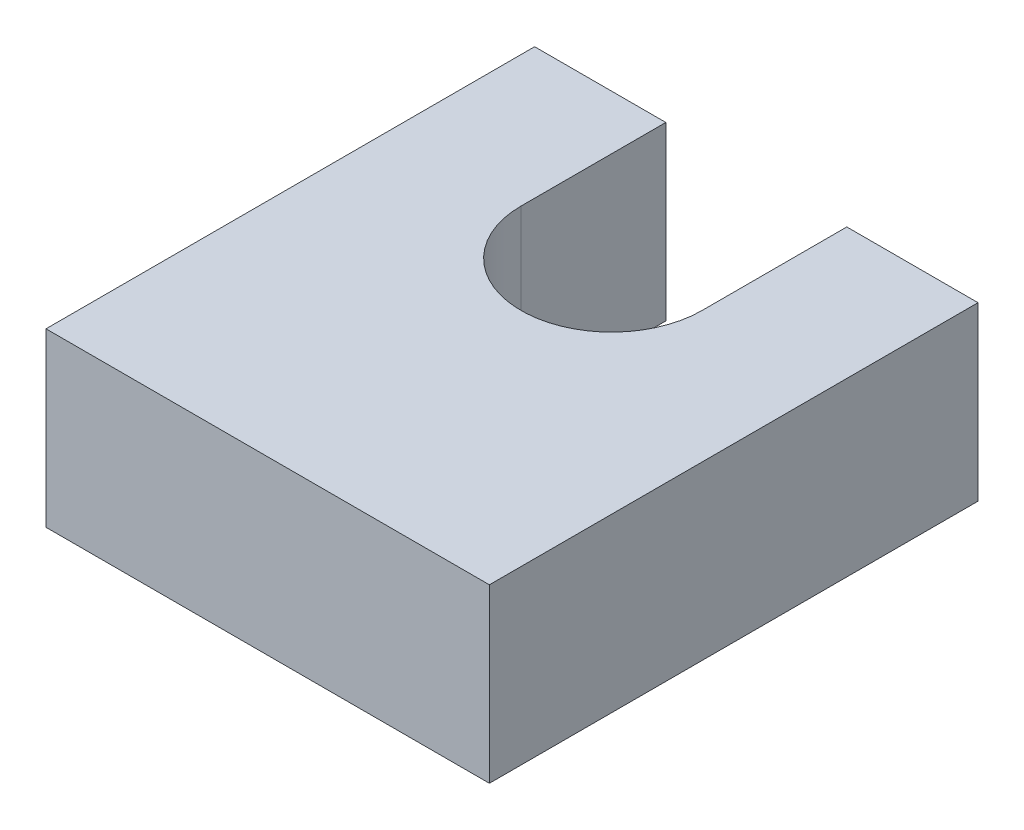
ISO-10303-21;
HEADER;
FILE_DESCRIPTION(('STEP AP214'),'2;1');
FILE_NAME('part.step','',(''),(''),'','','');
FILE_SCHEMA(('AUTOMOTIVE_DESIGN { 1 0 10303 214 1 1 1 1 }'));
ENDSEC;
DATA;
#1=APPLICATION_CONTEXT('core data for automotive mechanical design processes');
#2=APPLICATION_PROTOCOL_DEFINITION('international standard','automotive_design',2000,#1);
#3=PRODUCT_CONTEXT('',#1,'mechanical');
#4=PRODUCT('Part','Part','',(#3));
#5=PRODUCT_RELATED_PRODUCT_CATEGORY('part','',(#4));
#6=PRODUCT_DEFINITION_FORMATION('','',#4);
#7=PRODUCT_DEFINITION_CONTEXT('part definition',#1,'design');
#8=PRODUCT_DEFINITION('design','',#6,#7);
#9=PRODUCT_DEFINITION_SHAPE('','',#8);
#10=(LENGTH_UNIT() NAMED_UNIT(*) SI_UNIT(.MILLI.,.METRE.));
#11=(NAMED_UNIT(*) PLANE_ANGLE_UNIT() SI_UNIT($,.RADIAN.));
#12=(NAMED_UNIT(*) SI_UNIT($,.STERADIAN.) SOLID_ANGLE_UNIT());
#13=UNCERTAINTY_MEASURE_WITH_UNIT(LENGTH_MEASURE(1.E-05),#10,'distance_accuracy_value','');
#14=(GEOMETRIC_REPRESENTATION_CONTEXT(3) GLOBAL_UNCERTAINTY_ASSIGNED_CONTEXT((#13)) GLOBAL_UNIT_ASSIGNED_CONTEXT((#10,
#11,#12)) REPRESENTATION_CONTEXT('',''));
#15=CARTESIAN_POINT('',(0.,0.,0.));
#16=DIRECTION('',(0.,0.,1.));
#17=DIRECTION('',(1.,0.,0.));
#18=AXIS2_PLACEMENT_3D('',#15,#16,#17);
#19=CARTESIAN_POINT('',(5.,9.5,0.));
#20=DIRECTION('',(-1.,0.,0.));
#21=DIRECTION('',(0.,0.,1.));
#22=AXIS2_PLACEMENT_3D('',#19,#20,#21);
#23=PLANE('',#22);
#24=DIRECTION('',(0.,0.,-1.));
#25=VECTOR('',#24,1.);
#26=CARTESIAN_POINT('',(5.,0.,0.));
#27=LINE('',#26,#25);
#28=CARTESIAN_POINT('',(5.,0.,0.));
#29=VERTEX_POINT('',#28);
#30=CARTESIAN_POINT('',(5.,0.,-8.));
#31=VERTEX_POINT('',#30);
#32=EDGE_CURVE('E133',#29,#31,#27,.T.);
#33=ORIENTED_EDGE('',*,*,#32,.F.);
#34=DIRECTION('',(0.,-1.,0.));
#35=VECTOR('',#34,1.);
#36=CARTESIAN_POINT('',(5.,9.5,0.));
#37=LINE('',#36,#35);
#38=CARTESIAN_POINT('',(5.,9.5,0.));
#39=VERTEX_POINT('',#38);
#40=EDGE_CURVE('E11',#39,#29,#37,.T.);
#41=ORIENTED_EDGE('',*,*,#40,.F.);
#42=DIRECTION('',(0.,0.,-1.));
#43=VECTOR('',#42,1.);
#44=CARTESIAN_POINT('',(5.,9.5,0.));
#45=LINE('',#44,#43);
#46=CARTESIAN_POINT('',(5.,9.5,-8.));
#47=VERTEX_POINT('',#46);
#48=EDGE_CURVE('E174',#39,#47,#45,.T.);
#49=ORIENTED_EDGE('',*,*,#48,.T.);
#50=DIRECTION('',(0.,-1.,0.));
#51=VECTOR('',#50,1.);
#52=CARTESIAN_POINT('',(5.,9.5,-8.));
#53=LINE('',#52,#51);
#54=EDGE_CURVE('E91',#47,#31,#53,.T.);
#55=ORIENTED_EDGE('',*,*,#54,.T.);
#56=EDGE_LOOP('',(#33,#41,#49,#55));
#57=FACE_BOUND('',#56,.T.);
#58=ADVANCED_FACE('F41',(#57),#23,.T.);
#59=CARTESIAN_POINT('',(0.,9.5,0.));
#60=DIRECTION('',(0.,-1.,0.));
#61=DIRECTION('',(0.,0.,-1.));
#62=AXIS2_PLACEMENT_3D('',#59,#60,#61);
#63=CYLINDRICAL_SURFACE('',#62,5.);
#64=CARTESIAN_POINT('',(0.,0.,0.));
#65=DIRECTION('',(0.,1.,0.));
#66=DIRECTION('',(0.,0.,1.));
#67=AXIS2_PLACEMENT_3D('',#64,#65,#66);
#68=CIRCLE('',#67,5.);
#69=CARTESIAN_POINT('',(-5.,0.,0.));
#70=VERTEX_POINT('',#69);
#71=EDGE_CURVE('E136',#70,#29,#68,.T.);
#72=ORIENTED_EDGE('',*,*,#71,.F.);
#73=DIRECTION('',(0.,-1.,0.));
#74=VECTOR('',#73,1.);
#75=CARTESIAN_POINT('',(-5.,9.5,0.));
#76=LINE('',#75,#74);
#77=CARTESIAN_POINT('',(-5.,9.5,0.));
#78=VERTEX_POINT('',#77);
#79=EDGE_CURVE('E49',#78,#70,#76,.T.);
#80=ORIENTED_EDGE('',*,*,#79,.F.);
#81=CARTESIAN_POINT('',(0.,9.5,0.));
#82=DIRECTION('',(0.,1.,0.));
#83=DIRECTION('',(0.,0.,1.));
#84=AXIS2_PLACEMENT_3D('',#81,#82,#83);
#85=CIRCLE('',#84,5.);
#86=EDGE_CURVE('E171',#78,#39,#85,.T.);
#87=ORIENTED_EDGE('',*,*,#86,.T.);
#88=ORIENTED_EDGE('',*,*,#40,.T.);
#89=EDGE_LOOP('',(#72,#80,#87,#88));
#90=FACE_BOUND('',#89,.T.);
#91=ADVANCED_FACE('F170',(#90),#63,.F.);
#92=CARTESIAN_POINT('',(-5.,9.5,0.));
#93=DIRECTION('',(-1.,0.,0.));
#94=DIRECTION('',(0.,0.,1.));
#95=AXIS2_PLACEMENT_3D('',#92,#93,#94);
#96=PLANE('',#95);
#97=DIRECTION('',(0.,0.,-1.));
#98=VECTOR('',#97,1.);
#99=CARTESIAN_POINT('',(-5.,0.,0.));
#100=LINE('',#99,#98);
#101=CARTESIAN_POINT('',(-5.,0.,-8.));
#102=VERTEX_POINT('',#101);
#103=EDGE_CURVE('E139',#70,#102,#100,.T.);
#104=ORIENTED_EDGE('',*,*,#103,.T.);
#105=DIRECTION('',(0.,-1.,0.));
#106=VECTOR('',#105,1.);
#107=CARTESIAN_POINT('',(-5.,9.5,-8.));
#108=LINE('',#107,#106);
#109=CARTESIAN_POINT('',(-5.,9.5,-8.));
#110=VERTEX_POINT('',#109);
#111=EDGE_CURVE('E155',#110,#102,#108,.T.);
#112=ORIENTED_EDGE('',*,*,#111,.F.);
#113=DIRECTION('',(0.,0.,-1.));
#114=VECTOR('',#113,1.);
#115=CARTESIAN_POINT('',(-5.,9.5,0.));
#116=LINE('',#115,#114);
#117=EDGE_CURVE('E162',#78,#110,#116,.T.);
#118=ORIENTED_EDGE('',*,*,#117,.F.);
#119=ORIENTED_EDGE('',*,*,#79,.T.);
#120=EDGE_LOOP('',(#104,#112,#118,#119));
#121=FACE_BOUND('',#120,.T.);
#122=ADVANCED_FACE('F160',(#121),#96,.F.);
#123=CARTESIAN_POINT('',(0.,9.5,-7.99999999999999));
#124=DIRECTION('',(0.,0.,1.));
#125=DIRECTION('',(1.,0.,0.));
#126=AXIS2_PLACEMENT_3D('',#123,#124,#125);
#127=PLANE('',#126);
#128=DIRECTION('',(-1.,0.,0.));
#129=VECTOR('',#128,1.);
#130=CARTESIAN_POINT('',(0.,0.,-7.99999999999999));
#131=LINE('',#130,#129);
#132=CARTESIAN_POINT('',(-12.25,0.,-7.99999999999999));
#133=VERTEX_POINT('',#132);
#134=EDGE_CURVE('E141',#102,#133,#131,.T.);
#135=ORIENTED_EDGE('',*,*,#134,.T.);
#136=DIRECTION('',(0.,-1.,0.));
#137=VECTOR('',#136,1.);
#138=CARTESIAN_POINT('',(-12.25,9.5,-7.99999999999999));
#139=LINE('',#138,#137);
#140=CARTESIAN_POINT('',(-12.25,9.5,-7.99999999999999));
#141=VERTEX_POINT('',#140);
#142=EDGE_CURVE('E153',#141,#133,#139,.T.);
#143=ORIENTED_EDGE('',*,*,#142,.F.);
#144=DIRECTION('',(-1.,0.,0.));
#145=VECTOR('',#144,1.);
#146=CARTESIAN_POINT('',(0.,9.5,-7.99999999999999));
#147=LINE('',#146,#145);
#148=EDGE_CURVE('E129',#110,#141,#147,.T.);
#149=ORIENTED_EDGE('',*,*,#148,.F.);
#150=ORIENTED_EDGE('',*,*,#111,.T.);
#151=EDGE_LOOP('',(#135,#143,#149,#150));
#152=FACE_BOUND('',#151,.T.);
#153=ADVANCED_FACE('F181',(#152),#127,.F.);
#154=CARTESIAN_POINT('',(-12.25,9.5,0.));
#155=DIRECTION('',(-1.,0.,0.));
#156=DIRECTION('',(0.,0.,1.));
#157=AXIS2_PLACEMENT_3D('',#154,#155,#156);
#158=PLANE('',#157);
#159=DIRECTION('',(0.,0.,-1.));
#160=VECTOR('',#159,1.);
#161=CARTESIAN_POINT('',(-12.25,0.,0.));
#162=LINE('',#161,#160);
#163=CARTESIAN_POINT('',(-12.25,0.,19.));
#164=VERTEX_POINT('',#163);
#165=EDGE_CURVE('E144',#164,#133,#162,.T.);
#166=ORIENTED_EDGE('',*,*,#165,.F.);
#167=DIRECTION('',(0.,-1.,0.));
#168=VECTOR('',#167,1.);
#169=CARTESIAN_POINT('',(-12.25,9.5,19.));
#170=LINE('',#169,#168);
#171=CARTESIAN_POINT('',(-12.25,9.5,19.));
#172=VERTEX_POINT('',#171);
#173=EDGE_CURVE('E118',#172,#164,#170,.T.);
#174=ORIENTED_EDGE('',*,*,#173,.F.);
#175=DIRECTION('',(0.,0.,-1.));
#176=VECTOR('',#175,1.);
#177=CARTESIAN_POINT('',(-12.25,9.5,0.));
#178=LINE('',#177,#176);
#179=EDGE_CURVE('E127',#172,#141,#178,.T.);
#180=ORIENTED_EDGE('',*,*,#179,.T.);
#181=ORIENTED_EDGE('',*,*,#142,.T.);
#182=EDGE_LOOP('',(#166,#174,#180,#181));
#183=FACE_BOUND('',#182,.T.);
#184=ADVANCED_FACE('F184',(#183),#158,.T.);
#185=CARTESIAN_POINT('',(0.,9.5,19.));
#186=DIRECTION('',(0.,0.,1.));
#187=DIRECTION('',(1.,0.,0.));
#188=AXIS2_PLACEMENT_3D('',#185,#186,#187);
#189=PLANE('',#188);
#190=DIRECTION('',(-1.,0.,0.));
#191=VECTOR('',#190,1.);
#192=CARTESIAN_POINT('',(0.,0.,19.));
#193=LINE('',#192,#191);
#194=CARTESIAN_POINT('',(12.25,0.,19.));
#195=VERTEX_POINT('',#194);
#196=EDGE_CURVE('E117',#195,#164,#193,.T.);
#197=ORIENTED_EDGE('',*,*,#196,.F.);
#198=DIRECTION('',(0.,-1.,0.));
#199=VECTOR('',#198,1.);
#200=CARTESIAN_POINT('',(12.25,9.5,19.));
#201=LINE('',#200,#199);
#202=CARTESIAN_POINT('',(12.25,9.5,19.));
#203=VERTEX_POINT('',#202);
#204=EDGE_CURVE('E111',#203,#195,#201,.T.);
#205=ORIENTED_EDGE('',*,*,#204,.F.);
#206=DIRECTION('',(-1.,0.,0.));
#207=VECTOR('',#206,1.);
#208=CARTESIAN_POINT('',(0.,9.5,19.));
#209=LINE('',#208,#207);
#210=EDGE_CURVE('E115',#203,#172,#209,.T.);
#211=ORIENTED_EDGE('',*,*,#210,.T.);
#212=ORIENTED_EDGE('',*,*,#173,.T.);
#213=EDGE_LOOP('',(#197,#205,#211,#212));
#214=FACE_BOUND('',#213,.T.);
#215=ADVANCED_FACE('F113',(#214),#189,.T.);
#216=CARTESIAN_POINT('',(12.25,9.5,0.));
#217=DIRECTION('',(-1.,0.,0.));
#218=DIRECTION('',(0.,0.,1.));
#219=AXIS2_PLACEMENT_3D('',#216,#217,#218);
#220=PLANE('',#219);
#221=DIRECTION('',(0.,0.,-1.));
#222=VECTOR('',#221,1.);
#223=CARTESIAN_POINT('',(12.25,0.,0.));
#224=LINE('',#223,#222);
#225=CARTESIAN_POINT('',(12.25,0.,-8.));
#226=VERTEX_POINT('',#225);
#227=EDGE_CURVE('E84',#195,#226,#224,.T.);
#228=ORIENTED_EDGE('',*,*,#227,.T.);
#229=DIRECTION('',(0.,-1.,0.));
#230=VECTOR('',#229,1.);
#231=CARTESIAN_POINT('',(12.25,9.5,-8.));
#232=LINE('',#231,#230);
#233=CARTESIAN_POINT('',(12.25,9.5,-8.));
#234=VERTEX_POINT('',#233);
#235=EDGE_CURVE('E119',#234,#226,#232,.T.);
#236=ORIENTED_EDGE('',*,*,#235,.F.);
#237=DIRECTION('',(0.,0.,-1.));
#238=VECTOR('',#237,1.);
#239=CARTESIAN_POINT('',(12.25,9.5,0.));
#240=LINE('',#239,#238);
#241=EDGE_CURVE('E121',#203,#234,#240,.T.);
#242=ORIENTED_EDGE('',*,*,#241,.F.);
#243=ORIENTED_EDGE('',*,*,#204,.T.);
#244=EDGE_LOOP('',(#228,#236,#242,#243));
#245=FACE_BOUND('',#244,.T.);
#246=ADVANCED_FACE('F122',(#245),#220,.F.);
#247=EDGE_CURVE('E145',#226,#31,#131,.T.);
#248=ORIENTED_EDGE('',*,*,#247,.T.);
#249=ORIENTED_EDGE('',*,*,#54,.F.);
#250=EDGE_CURVE('E57',#234,#47,#147,.T.);
#251=ORIENTED_EDGE('',*,*,#250,.F.);
#252=ORIENTED_EDGE('',*,*,#235,.T.);
#253=EDGE_LOOP('',(#248,#249,#251,#252));
#254=FACE_BOUND('',#253,.T.);
#255=ADVANCED_FACE('F193',(#254),#127,.F.);
#256=CARTESIAN_POINT('',(0.,9.5,0.));
#257=DIRECTION('',(0.,1.,0.));
#258=DIRECTION('',(0.,0.,1.));
#259=AXIS2_PLACEMENT_3D('',#256,#257,#258);
#260=PLANE('',#259);
#261=ORIENTED_EDGE('',*,*,#48,.F.);
#262=ORIENTED_EDGE('',*,*,#86,.F.);
#263=ORIENTED_EDGE('',*,*,#117,.T.);
#264=ORIENTED_EDGE('',*,*,#148,.T.);
#265=ORIENTED_EDGE('',*,*,#179,.F.);
#266=ORIENTED_EDGE('',*,*,#210,.F.);
#267=ORIENTED_EDGE('',*,*,#241,.T.);
#268=ORIENTED_EDGE('',*,*,#250,.T.);
#269=EDGE_LOOP('',(#261,#262,#263,#264,#265,#266,#267,#268));
#270=FACE_BOUND('',#269,.T.);
#271=ADVANCED_FACE('F125',(#270),#260,.T.);
#272=CARTESIAN_POINT('',(0.,0.,0.));
#273=DIRECTION('',(0.,1.,0.));
#274=DIRECTION('',(0.,0.,1.));
#275=AXIS2_PLACEMENT_3D('',#272,#273,#274);
#276=PLANE('',#275);
#277=ORIENTED_EDGE('',*,*,#32,.T.);
#278=ORIENTED_EDGE('',*,*,#247,.F.);
#279=ORIENTED_EDGE('',*,*,#227,.F.);
#280=ORIENTED_EDGE('',*,*,#196,.T.);
#281=ORIENTED_EDGE('',*,*,#165,.T.);
#282=ORIENTED_EDGE('',*,*,#134,.F.);
#283=ORIENTED_EDGE('',*,*,#103,.F.);
#284=ORIENTED_EDGE('',*,*,#71,.T.);
#285=EDGE_LOOP('',(#277,#278,#279,#280,#281,#282,#283,#284));
#286=FACE_BOUND('',#285,.T.);
#287=ADVANCED_FACE('F169',(#286),#276,.F.);
#288=CLOSED_SHELL('',(#58,#91,#122,#153,#184,#215,#246,#255,#271,#287));
#289=MANIFOLD_SOLID_BREP('B2',#288);
#290=ADVANCED_BREP_SHAPE_REPRESENTATION('',(#18,#289),#14);
#291=SHAPE_DEFINITION_REPRESENTATION(#9,#290);
ENDSEC;
END-ISO-10303-21;
